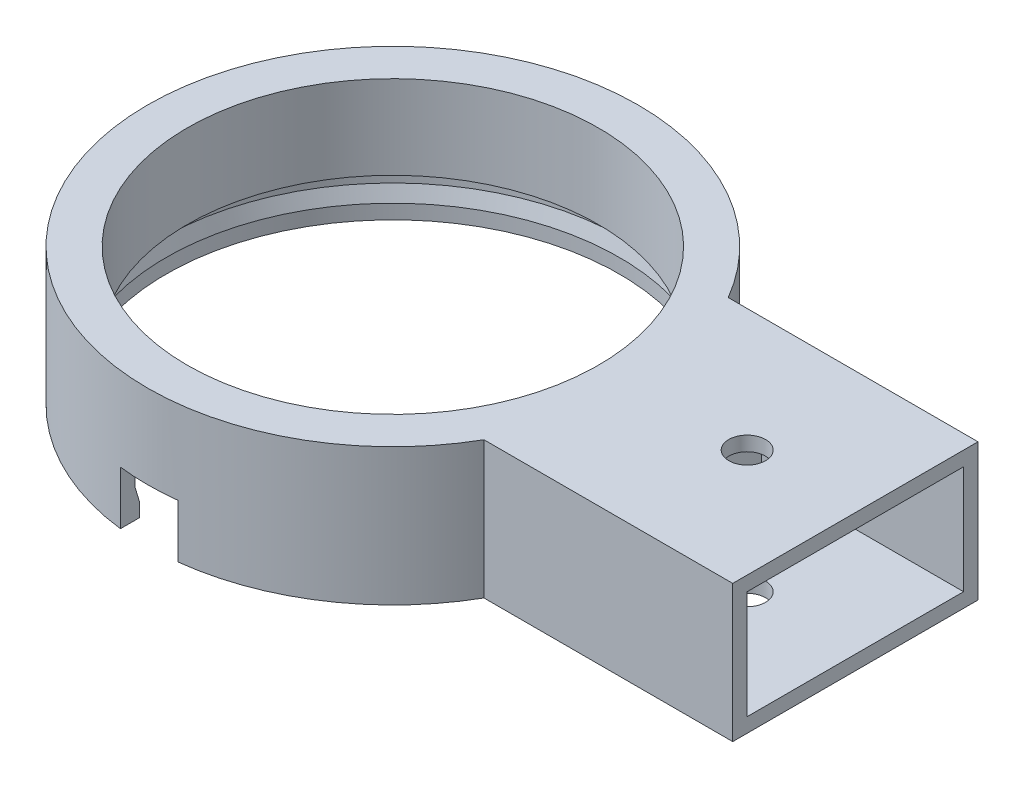
ISO-10303-21;
HEADER;
FILE_DESCRIPTION(('STEP AP214'),'2;1');
FILE_NAME('part.step','',(''),(''),'','','');
FILE_SCHEMA(('AUTOMOTIVE_DESIGN { 1 0 10303 214 1 1 1 1 }'));
ENDSEC;
DATA;
#1=APPLICATION_CONTEXT('core data for automotive mechanical design processes');
#2=APPLICATION_PROTOCOL_DEFINITION('international standard','automotive_design',2000,#1);
#3=PRODUCT_CONTEXT('',#1,'mechanical');
#4=PRODUCT('Part','Part','',(#3));
#5=PRODUCT_RELATED_PRODUCT_CATEGORY('part','',(#4));
#6=PRODUCT_DEFINITION_FORMATION('','',#4);
#7=PRODUCT_DEFINITION_CONTEXT('part definition',#1,'design');
#8=PRODUCT_DEFINITION('design','',#6,#7);
#9=PRODUCT_DEFINITION_SHAPE('','',#8);
#10=(LENGTH_UNIT() NAMED_UNIT(*) SI_UNIT(.MILLI.,.METRE.));
#11=(NAMED_UNIT(*) PLANE_ANGLE_UNIT() SI_UNIT($,.RADIAN.));
#12=(NAMED_UNIT(*) SI_UNIT($,.STERADIAN.) SOLID_ANGLE_UNIT());
#13=UNCERTAINTY_MEASURE_WITH_UNIT(LENGTH_MEASURE(1.E-05),#10,'distance_accuracy_value','');
#14=(GEOMETRIC_REPRESENTATION_CONTEXT(3) GLOBAL_UNCERTAINTY_ASSIGNED_CONTEXT((#13)) GLOBAL_UNIT_ASSIGNED_CONTEXT((#10,
#11,#12)) REPRESENTATION_CONTEXT('',''));
#15=CARTESIAN_POINT('',(0.,0.,0.));
#16=DIRECTION('',(0.,0.,1.));
#17=DIRECTION('',(1.,0.,0.));
#18=AXIS2_PLACEMENT_3D('',#15,#16,#17);
#19=CARTESIAN_POINT('',(0.,2.54,0.));
#20=DIRECTION('',(0.,-1.,0.));
#21=DIRECTION('',(0.,0.,-1.));
#22=AXIS2_PLACEMENT_3D('',#19,#20,#21);
#23=CYLINDRICAL_SURFACE('',#22,43.18);
#24=CARTESIAN_POINT('',(0.,-9.39800000000001,0.));
#25=DIRECTION('',(0.,-1.,0.));
#26=DIRECTION('',(0.,0.,-1.));
#27=AXIS2_PLACEMENT_3D('',#24,#25,#26);
#28=CIRCLE('',#27,43.18);
#29=CARTESIAN_POINT('',(37.4811405909692,-9.39800000000001,21.4400676304903));
#30=VERTEX_POINT('',#29);
#31=CARTESIAN_POINT('',(5.08,-9.39800000000001,42.8801352609807));
#32=VERTEX_POINT('',#31);
#33=EDGE_CURVE('E56',#30,#32,#28,.T.);
#34=ORIENTED_EDGE('',*,*,#33,.F.);
#35=DIRECTION('',(0.,-1.,0.));
#36=VECTOR('',#35,1.);
#37=CARTESIAN_POINT('',(37.4811405909692,2.54,21.4400676304903));
#38=LINE('',#37,#36);
#39=CARTESIAN_POINT('',(37.4811405909692,14.732,21.4400676304903));
#40=VERTEX_POINT('',#39);
#41=EDGE_CURVE('E186',#40,#30,#38,.T.);
#42=ORIENTED_EDGE('',*,*,#41,.F.);
#43=CARTESIAN_POINT('',(0.,14.732,0.));
#44=DIRECTION('',(0.,1.,0.));
#45=DIRECTION('',(0.,0.,1.));
#46=AXIS2_PLACEMENT_3D('',#43,#44,#45);
#47=CIRCLE('',#46,43.18);
#48=CARTESIAN_POINT('',(37.3080117477352,14.732,-21.7399323695097));
#49=VERTEX_POINT('',#48);
#50=EDGE_CURVE('E202',#49,#40,#47,.T.);
#51=ORIENTED_EDGE('',*,*,#50,.F.);
#52=DIRECTION('',(0.,-1.,0.));
#53=VECTOR('',#52,1.);
#54=CARTESIAN_POINT('',(37.3080117477352,2.54,-21.7399323695096));
#55=LINE('',#54,#53);
#56=CARTESIAN_POINT('',(37.3080117477116,-9.398,-21.7399323695097));
#57=VERTEX_POINT('',#56);
#58=EDGE_CURVE('E195',#57,#49,#55,.F.);
#59=ORIENTED_EDGE('',*,*,#58,.F.);
#60=CARTESIAN_POINT('',(-5.08,-9.39800000000001,42.8801352609807));
#61=VERTEX_POINT('',#60);
#62=EDGE_CURVE('E243',#61,#57,#28,.T.);
#63=ORIENTED_EDGE('',*,*,#62,.F.);
#64=DIRECTION('',(0.,-1.,0.));
#65=VECTOR('',#64,1.);
#66=CARTESIAN_POINT('',(-5.08,2.54,42.8801352609807));
#67=LINE('',#66,#65);
#68=CARTESIAN_POINT('',(-5.08,0.,42.8801352609807));
#69=VERTEX_POINT('',#68);
#70=EDGE_CURVE('E229',#61,#69,#67,.F.);
#71=ORIENTED_EDGE('',*,*,#70,.T.);
#72=CARTESIAN_POINT('',(0.,0.,0.));
#73=DIRECTION('',(0.,1.,0.));
#74=DIRECTION('',(-1.,0.,0.));
#75=AXIS2_PLACEMENT_3D('',#72,#73,#74);
#76=CIRCLE('',#75,43.18);
#77=CARTESIAN_POINT('',(5.08,0.,42.8801352609807));
#78=VERTEX_POINT('',#77);
#79=EDGE_CURVE('E232',#69,#78,#76,.T.);
#80=ORIENTED_EDGE('',*,*,#79,.T.);
#81=DIRECTION('',(0.,-1.,0.));
#82=VECTOR('',#81,1.);
#83=CARTESIAN_POINT('',(5.08,2.54,42.8801352609807));
#84=LINE('',#83,#82);
#85=EDGE_CURVE('E220',#32,#78,#84,.F.);
#86=ORIENTED_EDGE('',*,*,#85,.F.);
#87=EDGE_LOOP('',(#34,#42,#51,#59,#63,#71,#80,#86));
#88=FACE_BOUND('',#87,.T.);
#89=ADVANCED_FACE('F33',(#88),#23,.T.);
#90=CARTESIAN_POINT('',(0.,2.54,0.));
#91=DIRECTION('',(0.,-1.,0.));
#92=DIRECTION('',(0.,0.,-1.));
#93=AXIS2_PLACEMENT_3D('',#90,#91,#92);
#94=CYLINDRICAL_SURFACE('',#93,36.195);
#95=CARTESIAN_POINT('',(0.,0.,0.));
#96=DIRECTION('',(0.,1.,0.));
#97=DIRECTION('',(0.,0.,1.));
#98=AXIS2_PLACEMENT_3D('',#95,#96,#97);
#99=CIRCLE('',#98,36.195);
#100=CARTESIAN_POINT('',(0.,0.,36.195));
#101=VERTEX_POINT('',#100);
#102=EDGE_CURVE('E249',#101,#101,#99,.T.);
#103=ORIENTED_EDGE('',*,*,#102,.F.);
#104=EDGE_LOOP('',(#103));
#105=FACE_BOUND('',#104,.T.);
#106=CARTESIAN_POINT('',(0.,14.732,0.));
#107=DIRECTION('',(0.,1.,0.));
#108=DIRECTION('',(0.,0.,1.));
#109=AXIS2_PLACEMENT_3D('',#106,#107,#108);
#110=CIRCLE('',#109,36.195);
#111=CARTESIAN_POINT('',(0.,14.732,36.195));
#112=VERTEX_POINT('',#111);
#113=EDGE_CURVE('E199',#112,#112,#110,.T.);
#114=ORIENTED_EDGE('',*,*,#113,.T.);
#115=EDGE_LOOP('',(#114));
#116=FACE_BOUND('',#115,.T.);
#117=ADVANCED_FACE('F316',(#105,#116),#94,.F.);
#118=CARTESIAN_POINT('',(0.,0.,0.));
#119=DIRECTION('',(0.,1.,0.));
#120=DIRECTION('',(0.,0.,1.));
#121=AXIS2_PLACEMENT_3D('',#118,#119,#120);
#122=PLANE('',#121);
#123=DIRECTION('',(0.,0.,1.));
#124=VECTOR('',#123,1.);
#125=CARTESIAN_POINT('',(-5.08,0.,30.48));
#126=LINE('',#125,#124);
#127=CARTESIAN_POINT('',(-5.08,0.,40.3212499806244));
#128=VERTEX_POINT('',#127);
#129=EDGE_CURVE('E206',#128,#69,#126,.T.);
#130=ORIENTED_EDGE('',*,*,#129,.F.);
#131=CARTESIAN_POINT('',(0.,0.,0.));
#132=DIRECTION('',(0.,-1.,0.));
#133=DIRECTION('',(0.,0.,-1.));
#134=AXIS2_PLACEMENT_3D('',#131,#132,#133);
#135=CIRCLE('',#134,40.64);
#136=CARTESIAN_POINT('',(5.08,0.,40.3212499806244));
#137=VERTEX_POINT('',#136);
#138=EDGE_CURVE('E246',#128,#137,#135,.T.);
#139=ORIENTED_EDGE('',*,*,#138,.T.);
#140=DIRECTION('',(0.,0.,1.));
#141=VECTOR('',#140,1.);
#142=CARTESIAN_POINT('',(5.08,0.,30.48));
#143=LINE('',#142,#141);
#144=EDGE_CURVE('E205',#137,#78,#143,.T.);
#145=ORIENTED_EDGE('',*,*,#144,.T.);
#146=ORIENTED_EDGE('',*,*,#79,.F.);
#147=EDGE_LOOP('',(#130,#139,#145,#146));
#148=FACE_BOUND('',#147,.T.);
#149=ORIENTED_EDGE('',*,*,#102,.T.);
#150=EDGE_LOOP('',(#149));
#151=FACE_BOUND('',#150,.T.);
#152=ADVANCED_FACE('F320',(#148,#151),#122,.F.);
#153=CARTESIAN_POINT('',(0.,-4.318,0.));
#154=DIRECTION('',(0.,1.,0.));
#155=DIRECTION('',(0.,0.,1.));
#156=AXIS2_PLACEMENT_3D('',#153,#154,#155);
#157=CYLINDRICAL_SURFACE('',#156,40.64);
#158=DIRECTION('',(0.,1.,0.));
#159=VECTOR('',#158,1.);
#160=CARTESIAN_POINT('',(-5.08,-4.318,40.3212499806244));
#161=LINE('',#160,#159);
#162=CARTESIAN_POINT('',(-5.08,-4.318,40.3212499806244));
#163=VERTEX_POINT('',#162);
#164=EDGE_CURVE('E227',#163,#128,#161,.T.);
#165=ORIENTED_EDGE('',*,*,#164,.F.);
#166=CARTESIAN_POINT('',(0.,-4.318,0.));
#167=DIRECTION('',(0.,-1.,0.));
#168=DIRECTION('',(0.,0.,-1.));
#169=AXIS2_PLACEMENT_3D('',#166,#167,#168);
#170=CIRCLE('',#169,40.64);
#171=CARTESIAN_POINT('',(5.08,-4.318,40.3212499806244));
#172=VERTEX_POINT('',#171);
#173=EDGE_CURVE('E234',#163,#172,#170,.T.);
#174=ORIENTED_EDGE('',*,*,#173,.T.);
#175=DIRECTION('',(0.,1.,0.));
#176=VECTOR('',#175,1.);
#177=CARTESIAN_POINT('',(5.08,-4.318,40.3212499806244));
#178=LINE('',#177,#176);
#179=EDGE_CURVE('E217',#172,#137,#178,.T.);
#180=ORIENTED_EDGE('',*,*,#179,.T.);
#181=ORIENTED_EDGE('',*,*,#138,.F.);
#182=EDGE_LOOP('',(#165,#174,#180,#181));
#183=FACE_BOUND('',#182,.T.);
#184=ADVANCED_FACE('F326',(#183),#157,.F.);
#185=CARTESIAN_POINT('',(0.,-9.39800000000001,0.));
#186=DIRECTION('',(0.,-1.,0.));
#187=DIRECTION('',(0.,0.,-1.));
#188=AXIS2_PLACEMENT_3D('',#185,#186,#187);
#189=PLANE('',#188);
#190=CARTESIAN_POINT('',(62.23,-9.39800000000001,-0.149932369509652));
#191=DIRECTION('',(0.,-1.,0.));
#192=DIRECTION('',(0.,0.,-1.));
#193=AXIS2_PLACEMENT_3D('',#190,#191,#192);
#194=CIRCLE('',#193,3.23850000000001);
#195=CARTESIAN_POINT('',(62.23,-9.39800000000001,-3.38843236950966));
#196=VERTEX_POINT('',#195);
#197=EDGE_CURVE('E159',#196,#196,#194,.T.);
#198=ORIENTED_EDGE('',*,*,#197,.F.);
#199=EDGE_LOOP('',(#198));
#200=FACE_BOUND('',#199,.T.);
#201=DIRECTION('',(0.,0.,-1.));
#202=VECTOR('',#201,1.);
#203=CARTESIAN_POINT('',(-5.08,-9.39800000000001,0.));
#204=LINE('',#203,#202);
#205=CARTESIAN_POINT('',(-5.08,-9.39800000000001,39.5531096628318));
#206=VERTEX_POINT('',#205);
#207=EDGE_CURVE('E225',#61,#206,#204,.T.);
#208=ORIENTED_EDGE('',*,*,#207,.F.);
#209=ORIENTED_EDGE('',*,*,#62,.T.);
#210=DIRECTION('',(1.,0.,0.));
#211=VECTOR('',#210,1.);
#212=CARTESIAN_POINT('',(-500000.,-9.398,-21.7399323695097));
#213=LINE('',#212,#211);
#214=CARTESIAN_POINT('',(81.28,-9.398,-21.7399323695097));
#215=VERTEX_POINT('',#214);
#216=EDGE_CURVE('E193',#57,#215,#213,.T.);
#217=ORIENTED_EDGE('',*,*,#216,.T.);
#218=DIRECTION('',(0.,0.,-1.));
#219=VECTOR('',#218,1.);
#220=CARTESIAN_POINT('',(81.28,-9.398,-21.7399323695097));
#221=LINE('',#220,#219);
#222=CARTESIAN_POINT('',(81.28,-9.39800000000001,21.4400676304903));
#223=VERTEX_POINT('',#222);
#224=EDGE_CURVE('E177',#223,#215,#221,.T.);
#225=ORIENTED_EDGE('',*,*,#224,.F.);
#226=DIRECTION('',(1.,0.,0.));
#227=VECTOR('',#226,1.);
#228=CARTESIAN_POINT('',(-500000.,-9.39800000000001,21.4400676304903));
#229=LINE('',#228,#227);
#230=EDGE_CURVE('E188',#30,#223,#229,.T.);
#231=ORIENTED_EDGE('',*,*,#230,.F.);
#232=ORIENTED_EDGE('',*,*,#33,.T.);
#233=DIRECTION('',(0.,0.,-1.));
#234=VECTOR('',#233,1.);
#235=CARTESIAN_POINT('',(5.08,-9.39800000000001,0.));
#236=LINE('',#235,#234);
#237=CARTESIAN_POINT('',(5.08,-9.39800000000001,39.5531096628318));
#238=VERTEX_POINT('',#237);
#239=EDGE_CURVE('E214',#32,#238,#236,.T.);
#240=ORIENTED_EDGE('',*,*,#239,.T.);
#241=CARTESIAN_POINT('',(0.,-9.39800000000001,0.));
#242=DIRECTION('',(0.,-1.,0.));
#243=DIRECTION('',(0.,0.,-1.));
#244=AXIS2_PLACEMENT_3D('',#241,#242,#243);
#245=CIRCLE('',#244,39.878);
#246=EDGE_CURVE('E240',#206,#238,#245,.T.);
#247=ORIENTED_EDGE('',*,*,#246,.F.);
#248=EDGE_LOOP('',(#208,#209,#217,#225,#231,#232,#240,#247));
#249=FACE_BOUND('',#248,.T.);
#250=ADVANCED_FACE('F334',(#200,#249),#189,.T.);
#251=CARTESIAN_POINT('',(0.,0.,0.));
#252=DIRECTION('',(0.,-1.,0.));
#253=DIRECTION('',(0.,0.,-1.));
#254=AXIS2_PLACEMENT_3D('',#251,#252,#253);
#255=CYLINDRICAL_SURFACE('',#254,39.878);
#256=DIRECTION('',(0.,-1.,0.));
#257=VECTOR('',#256,1.);
#258=CARTESIAN_POINT('',(-5.08,0.,39.5531096628318));
#259=LINE('',#258,#257);
#260=CARTESIAN_POINT('',(-5.08,-6.858,39.5531096628318));
#261=VERTEX_POINT('',#260);
#262=EDGE_CURVE('E223',#206,#261,#259,.F.);
#263=ORIENTED_EDGE('',*,*,#262,.F.);
#264=ORIENTED_EDGE('',*,*,#246,.T.);
#265=DIRECTION('',(0.,-1.,0.));
#266=VECTOR('',#265,1.);
#267=CARTESIAN_POINT('',(5.08,0.,39.5531096628318));
#268=LINE('',#267,#266);
#269=CARTESIAN_POINT('',(5.08,-6.858,39.5531096628318));
#270=VERTEX_POINT('',#269);
#271=EDGE_CURVE('E209',#238,#270,#268,.F.);
#272=ORIENTED_EDGE('',*,*,#271,.T.);
#273=CARTESIAN_POINT('',(0.,-6.858,0.));
#274=DIRECTION('',(0.,-1.,0.));
#275=DIRECTION('',(0.,0.,-1.));
#276=AXIS2_PLACEMENT_3D('',#273,#274,#275);
#277=CIRCLE('',#276,39.878);
#278=EDGE_CURVE('E237',#261,#270,#277,.T.);
#279=ORIENTED_EDGE('',*,*,#278,.F.);
#280=EDGE_LOOP('',(#263,#264,#272,#279));
#281=FACE_BOUND('',#280,.T.);
#282=ADVANCED_FACE('F336',(#281),#255,.F.);
#283=CARTESIAN_POINT('',(0.,-4.318,0.));
#284=DIRECTION('',(0.,1.,0.));
#285=DIRECTION('',(0.,0.,1.));
#286=AXIS2_PLACEMENT_3D('',#283,#284,#285);
#287=CONICAL_SURFACE('',#286,40.64,0.291456794477867);
#288=CARTESIAN_POINT('',(-5.08,-24.7068434630951,34.147548746499));
#289=CARTESIAN_POINT('',(-5.08,-21.5469784913967,35.1059230986164));
#290=CARTESIAN_POINT('',(-5.08,-18.3868810290823,36.0635304620662));
#291=CARTESIAN_POINT('',(-5.08,-12.0663036754725,37.977481117305));
#292=CARTESIAN_POINT('',(-5.08,-8.90582378421784,38.9338244092286));
#293=CARTESIAN_POINT('',(-5.08,-2.5845635830175,40.8455169914528));
#294=CARTESIAN_POINT('',(-5.08,0.576216726915739,41.8008662817948));
#295=CARTESIAN_POINT('',(-5.08,6.89802538342526,43.7107450836756));
#296=CARTESIAN_POINT('',(-5.08,10.0590537300278,44.6652745951277));
#297=CARTESIAN_POINT('',(-5.08,13.2201795034403,45.6194812074669));
#298=B_SPLINE_CURVE_WITH_KNOTS('',3,(#288,#289,#290,#291,#292,#293,#294,#295,#296,#297),
.UNSPECIFIED.,.F.,.F.,(4,2,2,2,4),(0.,9.90601063903993,19.8120202227763,29.7180293949151,
39.6240396164624),.UNSPECIFIED.);
#299=EDGE_CURVE('E11',#261,#163,#298,.T.);
#300=ORIENTED_EDGE('',*,*,#299,.F.);
#301=ORIENTED_EDGE('',*,*,#278,.T.);
#302=CARTESIAN_POINT('',(5.08,-24.7068434630951,34.147548746499));
#303=CARTESIAN_POINT('',(5.08,-21.5469784913967,35.1059230986164));
#304=CARTESIAN_POINT('',(5.08,-18.3868810290822,36.0635304620662));
#305=CARTESIAN_POINT('',(5.08,-12.0663036754724,37.977481117305));
#306=CARTESIAN_POINT('',(5.08,-8.90582378421784,38.9338244092286));
#307=CARTESIAN_POINT('',(5.08,-2.5845635830175,40.8455169914528));
#308=CARTESIAN_POINT('',(5.08,0.576216726915742,41.8008662817948));
#309=CARTESIAN_POINT('',(5.08,6.89802538342526,43.7107450836756));
#310=CARTESIAN_POINT('',(5.08,10.0590537300278,44.6652745951277));
#311=CARTESIAN_POINT('',(5.08,13.2201795034403,45.6194812074669));
#312=B_SPLINE_CURVE_WITH_KNOTS('',3,(#302,#303,#304,#305,#306,#307,#308,#309,#310,#311),
.UNSPECIFIED.,.F.,.F.,(4,2,2,2,4),(0.,9.90601063903993,19.8120202227763,29.7180293949151,
39.6240396164624),.UNSPECIFIED.);
#313=EDGE_CURVE('E41',#270,#172,#312,.T.);
#314=ORIENTED_EDGE('',*,*,#313,.T.);
#315=ORIENTED_EDGE('',*,*,#173,.F.);
#316=EDGE_LOOP('',(#300,#301,#314,#315));
#317=FACE_BOUND('',#316,.T.);
#318=ADVANCED_FACE('F262',(#317),#287,.F.);
#319=CARTESIAN_POINT('',(-5.08,0.,30.48));
#320=DIRECTION('',(-1.,0.,0.));
#321=DIRECTION('',(0.,-1.,0.));
#322=AXIS2_PLACEMENT_3D('',#319,#320,#321);
#323=PLANE('',#322);
#324=ORIENTED_EDGE('',*,*,#207,.T.);
#325=ORIENTED_EDGE('',*,*,#262,.T.);
#326=ORIENTED_EDGE('',*,*,#299,.T.);
#327=ORIENTED_EDGE('',*,*,#164,.T.);
#328=ORIENTED_EDGE('',*,*,#129,.T.);
#329=ORIENTED_EDGE('',*,*,#70,.F.);
#330=EDGE_LOOP('',(#324,#325,#326,#327,#328,#329));
#331=FACE_BOUND('',#330,.T.);
#332=ADVANCED_FACE('F269',(#331),#323,.F.);
#333=CARTESIAN_POINT('',(5.08,0.,30.48));
#334=DIRECTION('',(-1.,0.,0.));
#335=DIRECTION('',(0.,-1.,0.));
#336=AXIS2_PLACEMENT_3D('',#333,#334,#335);
#337=PLANE('',#336);
#338=ORIENTED_EDGE('',*,*,#85,.T.);
#339=ORIENTED_EDGE('',*,*,#144,.F.);
#340=ORIENTED_EDGE('',*,*,#179,.F.);
#341=ORIENTED_EDGE('',*,*,#313,.F.);
#342=ORIENTED_EDGE('',*,*,#271,.F.);
#343=ORIENTED_EDGE('',*,*,#239,.F.);
#344=EDGE_LOOP('',(#338,#339,#340,#341,#342,#343));
#345=FACE_BOUND('',#344,.T.);
#346=ADVANCED_FACE('F265',(#345),#337,.T.);
#347=CARTESIAN_POINT('',(0.,14.732,0.));
#348=DIRECTION('',(0.,1.,0.));
#349=DIRECTION('',(0.,0.,1.));
#350=AXIS2_PLACEMENT_3D('',#347,#348,#349);
#351=PLANE('',#350);
#352=CARTESIAN_POINT('',(62.23,14.732,-0.149932369509652));
#353=DIRECTION('',(0.,1.,0.));
#354=DIRECTION('',(0.,0.,1.));
#355=AXIS2_PLACEMENT_3D('',#352,#353,#354);
#356=CIRCLE('',#355,3.23850000000001);
#357=CARTESIAN_POINT('',(62.23,14.732,3.08856763049035));
#358=VERTEX_POINT('',#357);
#359=EDGE_CURVE('E535',#358,#358,#356,.T.);
#360=ORIENTED_EDGE('',*,*,#359,.F.);
#361=EDGE_LOOP('',(#360));
#362=FACE_BOUND('',#361,.T.);
#363=ORIENTED_EDGE('',*,*,#50,.T.);
#364=DIRECTION('',(1.,0.,0.));
#365=VECTOR('',#364,1.);
#366=CARTESIAN_POINT('',(-500000.,14.732,21.4400676304903));
#367=LINE('',#366,#365);
#368=CARTESIAN_POINT('',(81.28,14.732,21.4400676304903));
#369=VERTEX_POINT('',#368);
#370=EDGE_CURVE('E190',#40,#369,#367,.T.);
#371=ORIENTED_EDGE('',*,*,#370,.T.);
#372=DIRECTION('',(0.,0.,1.));
#373=VECTOR('',#372,1.);
#374=CARTESIAN_POINT('',(81.28,14.732,21.4400676304903));
#375=LINE('',#374,#373);
#376=CARTESIAN_POINT('',(81.28,14.732,-21.7399323695097));
#377=VERTEX_POINT('',#376);
#378=EDGE_CURVE('E183',#377,#369,#375,.T.);
#379=ORIENTED_EDGE('',*,*,#378,.F.);
#380=DIRECTION('',(1.,0.,0.));
#381=VECTOR('',#380,1.);
#382=CARTESIAN_POINT('',(-500000.,14.732,-21.7399323695097));
#383=LINE('',#382,#381);
#384=EDGE_CURVE('E192',#49,#377,#383,.T.);
#385=ORIENTED_EDGE('',*,*,#384,.F.);
#386=EDGE_LOOP('',(#363,#371,#379,#385));
#387=FACE_BOUND('',#386,.T.);
#388=ORIENTED_EDGE('',*,*,#113,.F.);
#389=EDGE_LOOP('',(#388));
#390=FACE_BOUND('',#389,.T.);
#391=ADVANCED_FACE('F268',(#362,#387,#390),#351,.T.);
#392=CARTESIAN_POINT('',(-500000.,-9.398,-21.7399323695097));
#393=DIRECTION('',(0.,0.,-1.));
#394=DIRECTION('',(-1.,0.,0.));
#395=AXIS2_PLACEMENT_3D('',#392,#393,#394);
#396=PLANE('',#395);
#397=ORIENTED_EDGE('',*,*,#216,.F.);
#398=ORIENTED_EDGE('',*,*,#58,.T.);
#399=ORIENTED_EDGE('',*,*,#384,.T.);
#400=DIRECTION('',(0.,1.,0.));
#401=VECTOR('',#400,1.);
#402=CARTESIAN_POINT('',(81.28,14.732,-21.7399323695097));
#403=LINE('',#402,#401);
#404=EDGE_CURVE('E180',#215,#377,#403,.T.);
#405=ORIENTED_EDGE('',*,*,#404,.F.);
#406=EDGE_LOOP('',(#397,#398,#399,#405));
#407=FACE_BOUND('',#406,.T.);
#408=ADVANCED_FACE('F277',(#407),#396,.T.);
#409=CARTESIAN_POINT('',(-500000.,14.732,21.4400676304903));
#410=DIRECTION('',(0.,0.,1.));
#411=DIRECTION('',(1.,0.,0.));
#412=AXIS2_PLACEMENT_3D('',#409,#410,#411);
#413=PLANE('',#412);
#414=ORIENTED_EDGE('',*,*,#370,.F.);
#415=ORIENTED_EDGE('',*,*,#41,.T.);
#416=ORIENTED_EDGE('',*,*,#230,.T.);
#417=DIRECTION('',(0.,-1.,0.));
#418=VECTOR('',#417,1.);
#419=CARTESIAN_POINT('',(81.28,-9.39800000000001,21.4400676304903));
#420=LINE('',#419,#418);
#421=EDGE_CURVE('E171',#369,#223,#420,.T.);
#422=ORIENTED_EDGE('',*,*,#421,.F.);
#423=EDGE_LOOP('',(#414,#415,#416,#422));
#424=FACE_BOUND('',#423,.T.);
#425=ADVANCED_FACE('F281',(#424),#413,.T.);
#426=CARTESIAN_POINT('',(81.28,0.,0.));
#427=DIRECTION('',(-1.,0.,0.));
#428=DIRECTION('',(0.,0.,1.));
#429=AXIS2_PLACEMENT_3D('',#426,#427,#428);
#430=PLANE('',#429);
#431=DIRECTION('',(0.,-1.,0.));
#432=VECTOR('',#431,1.);
#433=CARTESIAN_POINT('',(81.28,12.192,18.9000676304903));
#434=LINE('',#433,#432);
#435=CARTESIAN_POINT('',(81.28,12.192,18.9000676304903));
#436=VERTEX_POINT('',#435);
#437=CARTESIAN_POINT('',(81.28,-6.858,18.9000676304903));
#438=VERTEX_POINT('',#437);
#439=EDGE_CURVE('E165',#436,#438,#434,.T.);
#440=ORIENTED_EDGE('',*,*,#439,.F.);
#441=DIRECTION('',(0.,0.,1.));
#442=VECTOR('',#441,1.);
#443=CARTESIAN_POINT('',(81.28,12.192,-19.1999323695096));
#444=LINE('',#443,#442);
#445=CARTESIAN_POINT('',(81.28,12.192,-19.1999323695096));
#446=VERTEX_POINT('',#445);
#447=EDGE_CURVE('E48',#446,#436,#444,.T.);
#448=ORIENTED_EDGE('',*,*,#447,.F.);
#449=DIRECTION('',(0.,1.,0.));
#450=VECTOR('',#449,1.);
#451=CARTESIAN_POINT('',(81.28,-6.858,-19.1999323695096));
#452=LINE('',#451,#450);
#453=CARTESIAN_POINT('',(81.28,-6.858,-19.1999323695096));
#454=VERTEX_POINT('',#453);
#455=EDGE_CURVE('E153',#454,#446,#452,.T.);
#456=ORIENTED_EDGE('',*,*,#455,.F.);
#457=DIRECTION('',(0.,0.,-1.));
#458=VECTOR('',#457,1.);
#459=CARTESIAN_POINT('',(81.28,-6.858,18.9000676304903));
#460=LINE('',#459,#458);
#461=EDGE_CURVE('E156',#438,#454,#460,.T.);
#462=ORIENTED_EDGE('',*,*,#461,.F.);
#463=EDGE_LOOP('',(#440,#448,#456,#462));
#464=FACE_BOUND('',#463,.T.);
#465=ORIENTED_EDGE('',*,*,#421,.T.);
#466=ORIENTED_EDGE('',*,*,#224,.T.);
#467=ORIENTED_EDGE('',*,*,#404,.T.);
#468=ORIENTED_EDGE('',*,*,#378,.T.);
#469=EDGE_LOOP('',(#465,#466,#467,#468));
#470=FACE_BOUND('',#469,.T.);
#471=ADVANCED_FACE('F285',(#464,#470),#430,.F.);
#472=CARTESIAN_POINT('',(45.72,12.192,-19.1999323695096));
#473=DIRECTION('',(0.,1.,0.));
#474=DIRECTION('',(0.,0.,1.));
#475=AXIS2_PLACEMENT_3D('',#472,#473,#474);
#476=PLANE('',#475);
#477=CARTESIAN_POINT('',(62.23,12.192,-0.149932369509652));
#478=DIRECTION('',(0.,1.,0.));
#479=DIRECTION('',(0.,0.,1.));
#480=AXIS2_PLACEMENT_3D('',#477,#478,#479);
#481=CIRCLE('',#480,3.23850000000001);
#482=CARTESIAN_POINT('',(62.23,12.192,3.08856763049035));
#483=VERTEX_POINT('',#482);
#484=EDGE_CURVE('E531',#483,#483,#481,.T.);
#485=ORIENTED_EDGE('',*,*,#484,.T.);
#486=EDGE_LOOP('',(#485));
#487=FACE_BOUND('',#486,.T.);
#488=ORIENTED_EDGE('',*,*,#447,.T.);
#489=DIRECTION('',(1.,0.,0.));
#490=VECTOR('',#489,1.);
#491=CARTESIAN_POINT('',(45.72,12.192,18.9000676304903));
#492=LINE('',#491,#490);
#493=CARTESIAN_POINT('',(45.72,12.192,18.9000676304903));
#494=VERTEX_POINT('',#493);
#495=EDGE_CURVE('E131',#494,#436,#492,.T.);
#496=ORIENTED_EDGE('',*,*,#495,.F.);
#497=DIRECTION('',(0.,0.,1.));
#498=VECTOR('',#497,1.);
#499=CARTESIAN_POINT('',(45.72,12.192,-19.1999323695096));
#500=LINE('',#499,#498);
#501=CARTESIAN_POINT('',(45.72,12.192,-19.1999323695096));
#502=VERTEX_POINT('',#501);
#503=EDGE_CURVE('E135',#502,#494,#500,.T.);
#504=ORIENTED_EDGE('',*,*,#503,.F.);
#505=DIRECTION('',(1.,0.,0.));
#506=VECTOR('',#505,1.);
#507=CARTESIAN_POINT('',(45.72,12.192,-19.1999323695096));
#508=LINE('',#507,#506);
#509=EDGE_CURVE('E169',#502,#446,#508,.T.);
#510=ORIENTED_EDGE('',*,*,#509,.T.);
#511=EDGE_LOOP('',(#488,#496,#504,#510));
#512=FACE_BOUND('',#511,.T.);
#513=ADVANCED_FACE('F133',(#487,#512),#476,.F.);
#514=CARTESIAN_POINT('',(45.72,-6.858,-19.1999323695096));
#515=DIRECTION('',(0.,0.,-1.));
#516=DIRECTION('',(-1.,0.,0.));
#517=AXIS2_PLACEMENT_3D('',#514,#515,#516);
#518=PLANE('',#517);
#519=ORIENTED_EDGE('',*,*,#455,.T.);
#520=ORIENTED_EDGE('',*,*,#509,.F.);
#521=DIRECTION('',(0.,1.,0.));
#522=VECTOR('',#521,1.);
#523=CARTESIAN_POINT('',(45.72,-6.858,-19.1999323695096));
#524=LINE('',#523,#522);
#525=CARTESIAN_POINT('',(45.72,-6.858,-19.1999323695096));
#526=VERTEX_POINT('',#525);
#527=EDGE_CURVE('E141',#526,#502,#524,.T.);
#528=ORIENTED_EDGE('',*,*,#527,.F.);
#529=DIRECTION('',(1.,0.,0.));
#530=VECTOR('',#529,1.);
#531=CARTESIAN_POINT('',(45.72,-6.858,-19.1999323695096));
#532=LINE('',#531,#530);
#533=EDGE_CURVE('E172',#526,#454,#532,.T.);
#534=ORIENTED_EDGE('',*,*,#533,.T.);
#535=EDGE_LOOP('',(#519,#520,#528,#534));
#536=FACE_BOUND('',#535,.T.);
#537=ADVANCED_FACE('F292',(#536),#518,.F.);
#538=CARTESIAN_POINT('',(45.72,-6.858,18.9000676304903));
#539=DIRECTION('',(0.,-1.,0.));
#540=DIRECTION('',(0.,0.,-1.));
#541=AXIS2_PLACEMENT_3D('',#538,#539,#540);
#542=PLANE('',#541);
#543=CARTESIAN_POINT('',(62.23,-6.858,-0.149932369509652));
#544=DIRECTION('',(0.,-1.,0.));
#545=DIRECTION('',(0.,0.,-1.));
#546=AXIS2_PLACEMENT_3D('',#543,#544,#545);
#547=CIRCLE('',#546,3.23850000000001);
#548=CARTESIAN_POINT('',(62.23,-6.858,-3.38843236950966));
#549=VERTEX_POINT('',#548);
#550=EDGE_CURVE('E36',#549,#549,#547,.T.);
#551=ORIENTED_EDGE('',*,*,#550,.T.);
#552=EDGE_LOOP('',(#551));
#553=FACE_BOUND('',#552,.T.);
#554=ORIENTED_EDGE('',*,*,#461,.T.);
#555=ORIENTED_EDGE('',*,*,#533,.F.);
#556=DIRECTION('',(0.,0.,-1.));
#557=VECTOR('',#556,1.);
#558=CARTESIAN_POINT('',(45.72,-6.858,18.9000676304903));
#559=LINE('',#558,#557);
#560=CARTESIAN_POINT('',(45.72,-6.858,18.9000676304903));
#561=VERTEX_POINT('',#560);
#562=EDGE_CURVE('E149',#561,#526,#559,.T.);
#563=ORIENTED_EDGE('',*,*,#562,.F.);
#564=DIRECTION('',(1.,0.,0.));
#565=VECTOR('',#564,1.);
#566=CARTESIAN_POINT('',(45.72,-6.858,18.9000676304903));
#567=LINE('',#566,#565);
#568=EDGE_CURVE('E140',#561,#438,#567,.T.);
#569=ORIENTED_EDGE('',*,*,#568,.T.);
#570=EDGE_LOOP('',(#554,#555,#563,#569));
#571=FACE_BOUND('',#570,.T.);
#572=ADVANCED_FACE('F296',(#553,#571),#542,.F.);
#573=CARTESIAN_POINT('',(45.72,12.192,18.9000676304903));
#574=DIRECTION('',(0.,0.,1.));
#575=DIRECTION('',(1.,0.,0.));
#576=AXIS2_PLACEMENT_3D('',#573,#574,#575);
#577=PLANE('',#576);
#578=ORIENTED_EDGE('',*,*,#439,.T.);
#579=ORIENTED_EDGE('',*,*,#568,.F.);
#580=DIRECTION('',(0.,-1.,0.));
#581=VECTOR('',#580,1.);
#582=CARTESIAN_POINT('',(45.72,12.192,18.9000676304903));
#583=LINE('',#582,#581);
#584=EDGE_CURVE('E144',#494,#561,#583,.T.);
#585=ORIENTED_EDGE('',*,*,#584,.F.);
#586=ORIENTED_EDGE('',*,*,#495,.T.);
#587=EDGE_LOOP('',(#578,#579,#585,#586));
#588=FACE_BOUND('',#587,.T.);
#589=ADVANCED_FACE('F145',(#588),#577,.F.);
#590=CARTESIAN_POINT('',(45.72,0.,0.));
#591=DIRECTION('',(1.,0.,0.));
#592=DIRECTION('',(0.,0.,-1.));
#593=AXIS2_PLACEMENT_3D('',#590,#591,#592);
#594=PLANE('',#593);
#595=ORIENTED_EDGE('',*,*,#503,.T.);
#596=ORIENTED_EDGE('',*,*,#584,.T.);
#597=ORIENTED_EDGE('',*,*,#562,.T.);
#598=ORIENTED_EDGE('',*,*,#527,.T.);
#599=EDGE_LOOP('',(#595,#596,#597,#598));
#600=FACE_BOUND('',#599,.T.);
#601=ADVANCED_FACE('F151',(#600),#594,.T.);
#602=CARTESIAN_POINT('',(62.23,-20.828,-0.149932369509652));
#603=DIRECTION('',(0.,1.,0.));
#604=DIRECTION('',(0.,0.,1.));
#605=AXIS2_PLACEMENT_3D('',#602,#603,#604);
#606=CYLINDRICAL_SURFACE('',#605,3.23850000000001);
#607=ORIENTED_EDGE('',*,*,#197,.T.);
#608=EDGE_LOOP('',(#607));
#609=FACE_BOUND('',#608,.T.);
#610=ORIENTED_EDGE('',*,*,#550,.F.);
#611=EDGE_LOOP('',(#610));
#612=FACE_BOUND('',#611,.T.);
#613=ADVANCED_FACE('F305',(#609,#612),#606,.F.);
#614=ORIENTED_EDGE('',*,*,#359,.T.);
#615=EDGE_LOOP('',(#614));
#616=FACE_BOUND('',#615,.T.);
#617=ORIENTED_EDGE('',*,*,#484,.F.);
#618=EDGE_LOOP('',(#617));
#619=FACE_BOUND('',#618,.T.);
#620=ADVANCED_FACE('F306',(#616,#619),#606,.F.);
#621=CLOSED_SHELL('',(#89,#117,#152,#184,#250,#282,#318,#332,#346,#391,#408,#425,#471,#513,#537,
#572,#589,#601,#613,#620));
#622=MANIFOLD_SOLID_BREP('B2',#621);
#623=ADVANCED_BREP_SHAPE_REPRESENTATION('',(#18,#622),#14);
#624=SHAPE_DEFINITION_REPRESENTATION(#9,#623);
ENDSEC;
END-ISO-10303-21;
